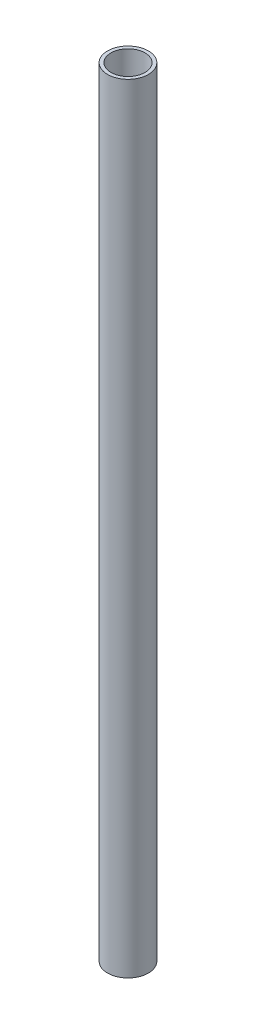
ISO-10303-21;
HEADER;
FILE_DESCRIPTION(('STEP AP214'),'2;1');
FILE_NAME('part.step','',(''),(''),'','','');
FILE_SCHEMA(('AUTOMOTIVE_DESIGN { 1 0 10303 214 1 1 1 1 }'));
ENDSEC;
DATA;
#1=APPLICATION_CONTEXT('core data for automotive mechanical design processes');
#2=APPLICATION_PROTOCOL_DEFINITION('international standard','automotive_design',2000,#1);
#3=PRODUCT_CONTEXT('',#1,'mechanical');
#4=PRODUCT('Part','Part','',(#3));
#5=PRODUCT_RELATED_PRODUCT_CATEGORY('part','',(#4));
#6=PRODUCT_DEFINITION_FORMATION('','',#4);
#7=PRODUCT_DEFINITION_CONTEXT('part definition',#1,'design');
#8=PRODUCT_DEFINITION('design','',#6,#7);
#9=PRODUCT_DEFINITION_SHAPE('','',#8);
#10=(LENGTH_UNIT() NAMED_UNIT(*) SI_UNIT(.MILLI.,.METRE.));
#11=(NAMED_UNIT(*) PLANE_ANGLE_UNIT() SI_UNIT($,.RADIAN.));
#12=(NAMED_UNIT(*) SI_UNIT($,.STERADIAN.) SOLID_ANGLE_UNIT());
#13=UNCERTAINTY_MEASURE_WITH_UNIT(LENGTH_MEASURE(1.E-05),#10,'distance_accuracy_value','');
#14=(GEOMETRIC_REPRESENTATION_CONTEXT(3) GLOBAL_UNCERTAINTY_ASSIGNED_CONTEXT((#13)) GLOBAL_UNIT_ASSIGNED_CONTEXT((#10,
#11,#12)) REPRESENTATION_CONTEXT('',''));
#15=CARTESIAN_POINT('',(0.,0.,0.));
#16=DIRECTION('',(0.,0.,1.));
#17=DIRECTION('',(1.,0.,0.));
#18=AXIS2_PLACEMENT_3D('',#15,#16,#17);
#19=CARTESIAN_POINT('',(0.,366.,0.));
#20=DIRECTION('',(0.,-1.,0.));
#21=DIRECTION('',(0.,0.,-1.));
#22=AXIS2_PLACEMENT_3D('',#19,#20,#21);
#23=CYLINDRICAL_SURFACE('',#22,8.);
#24=CARTESIAN_POINT('',(0.,366.,0.));
#25=DIRECTION('',(0.,1.,0.));
#26=DIRECTION('',(0.,0.,1.));
#27=AXIS2_PLACEMENT_3D('',#24,#25,#26);
#28=CIRCLE('',#27,8.);
#29=CARTESIAN_POINT('',(0.,366.,8.));
#30=VERTEX_POINT('',#29);
#31=EDGE_CURVE('E53',#30,#30,#28,.T.);
#32=ORIENTED_EDGE('',*,*,#31,.T.);
#33=EDGE_LOOP('',(#32));
#34=FACE_BOUND('',#33,.T.);
#35=CARTESIAN_POINT('',(0.,0.,0.));
#36=DIRECTION('',(0.,1.,0.));
#37=DIRECTION('',(0.,0.,1.));
#38=AXIS2_PLACEMENT_3D('',#35,#36,#37);
#39=CIRCLE('',#38,8.);
#40=CARTESIAN_POINT('',(0.,0.,8.));
#41=VERTEX_POINT('',#40);
#42=EDGE_CURVE('E60',#41,#41,#39,.T.);
#43=ORIENTED_EDGE('',*,*,#42,.F.);
#44=EDGE_LOOP('',(#43));
#45=FACE_BOUND('',#44,.T.);
#46=ADVANCED_FACE('F45',(#34,#45),#23,.F.);
#47=CARTESIAN_POINT('',(0.,366.,0.));
#48=DIRECTION('',(0.,-1.,0.));
#49=DIRECTION('',(0.,0.,-1.));
#50=AXIS2_PLACEMENT_3D('',#47,#48,#49);
#51=CYLINDRICAL_SURFACE('',#50,9.6);
#52=CARTESIAN_POINT('',(0.,366.,0.));
#53=DIRECTION('',(0.,1.,0.));
#54=DIRECTION('',(0.,0.,1.));
#55=AXIS2_PLACEMENT_3D('',#52,#53,#54);
#56=CIRCLE('',#55,9.6);
#57=CARTESIAN_POINT('',(0.,366.,9.6));
#58=VERTEX_POINT('',#57);
#59=EDGE_CURVE('E10',#58,#58,#56,.T.);
#60=ORIENTED_EDGE('',*,*,#59,.F.);
#61=EDGE_LOOP('',(#60));
#62=FACE_BOUND('',#61,.T.);
#63=CARTESIAN_POINT('',(0.,0.,0.));
#64=DIRECTION('',(0.,1.,0.));
#65=DIRECTION('',(0.,0.,1.));
#66=AXIS2_PLACEMENT_3D('',#63,#64,#65);
#67=CIRCLE('',#66,9.6);
#68=CARTESIAN_POINT('',(0.,0.,9.6));
#69=VERTEX_POINT('',#68);
#70=EDGE_CURVE('E48',#69,#69,#67,.T.);
#71=ORIENTED_EDGE('',*,*,#70,.T.);
#72=EDGE_LOOP('',(#71));
#73=FACE_BOUND('',#72,.T.);
#74=ADVANCED_FACE('F69',(#62,#73),#51,.T.);
#75=CARTESIAN_POINT('',(0.,366.,0.));
#76=DIRECTION('',(0.,1.,0.));
#77=DIRECTION('',(0.,0.,1.));
#78=AXIS2_PLACEMENT_3D('',#75,#76,#77);
#79=PLANE('',#78);
#80=ORIENTED_EDGE('',*,*,#31,.F.);
#81=EDGE_LOOP('',(#80));
#82=FACE_BOUND('',#81,.T.);
#83=ORIENTED_EDGE('',*,*,#59,.T.);
#84=EDGE_LOOP('',(#83));
#85=FACE_BOUND('',#84,.T.);
#86=ADVANCED_FACE('F73',(#82,#85),#79,.T.);
#87=CARTESIAN_POINT('',(0.,0.,0.));
#88=DIRECTION('',(0.,1.,0.));
#89=DIRECTION('',(0.,0.,1.));
#90=AXIS2_PLACEMENT_3D('',#87,#88,#89);
#91=PLANE('',#90);
#92=ORIENTED_EDGE('',*,*,#42,.T.);
#93=EDGE_LOOP('',(#92));
#94=FACE_BOUND('',#93,.T.);
#95=ORIENTED_EDGE('',*,*,#70,.F.);
#96=EDGE_LOOP('',(#95));
#97=FACE_BOUND('',#96,.T.);
#98=ADVANCED_FACE('F71',(#94,#97),#91,.F.);
#99=CLOSED_SHELL('',(#46,#74,#86,#98));
#100=MANIFOLD_SOLID_BREP('B2',#99);
#101=ADVANCED_BREP_SHAPE_REPRESENTATION('',(#18,#100),#14);
#102=SHAPE_DEFINITION_REPRESENTATION(#9,#101);
ENDSEC;
END-ISO-10303-21;
